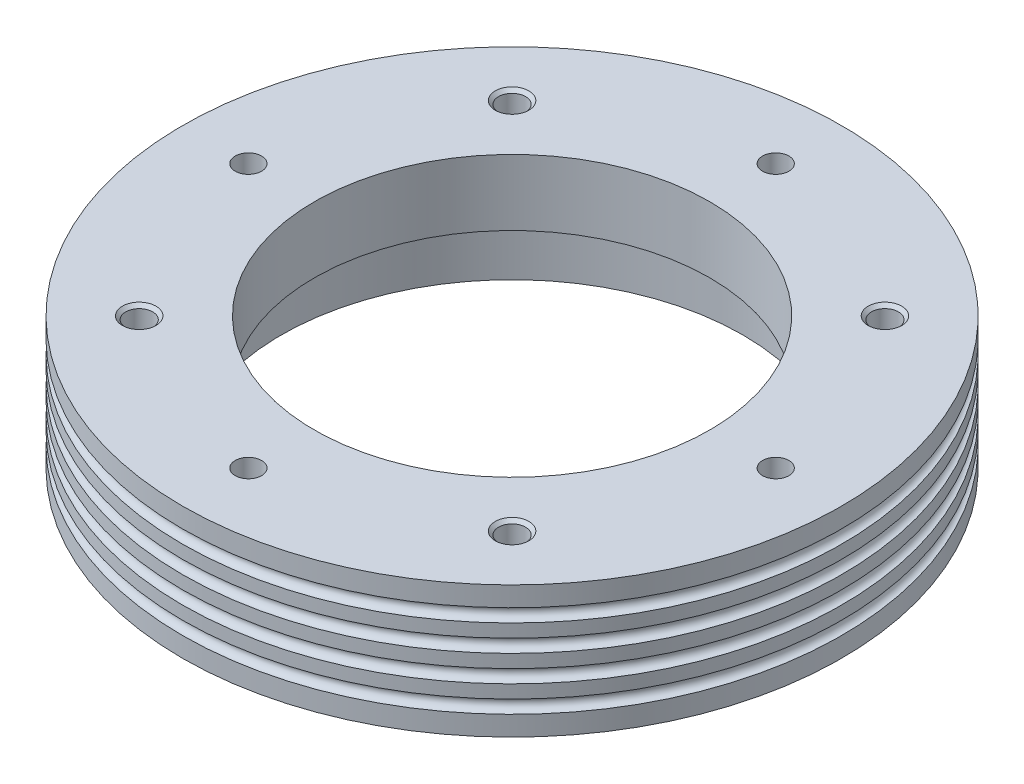
ISO-10303-21;
HEADER;
FILE_DESCRIPTION(('STEP AP214'),'2;1');
FILE_NAME('part.step','',(''),(''),'','','');
FILE_SCHEMA(('AUTOMOTIVE_DESIGN { 1 0 10303 214 1 1 1 1 }'));
ENDSEC;
DATA;
#1=APPLICATION_CONTEXT('core data for automotive mechanical design processes');
#2=APPLICATION_PROTOCOL_DEFINITION('international standard','automotive_design',2000,#1);
#3=PRODUCT_CONTEXT('',#1,'mechanical');
#4=PRODUCT('Part','Part','',(#3));
#5=PRODUCT_RELATED_PRODUCT_CATEGORY('part','',(#4));
#6=PRODUCT_DEFINITION_FORMATION('','',#4);
#7=PRODUCT_DEFINITION_CONTEXT('part definition',#1,'design');
#8=PRODUCT_DEFINITION('design','',#6,#7);
#9=PRODUCT_DEFINITION_SHAPE('','',#8);
#10=(LENGTH_UNIT() NAMED_UNIT(*) SI_UNIT(.MILLI.,.METRE.));
#11=(NAMED_UNIT(*) PLANE_ANGLE_UNIT() SI_UNIT($,.RADIAN.));
#12=(NAMED_UNIT(*) SI_UNIT($,.STERADIAN.) SOLID_ANGLE_UNIT());
#13=UNCERTAINTY_MEASURE_WITH_UNIT(LENGTH_MEASURE(1.E-05),#10,'distance_accuracy_value','');
#14=(GEOMETRIC_REPRESENTATION_CONTEXT(3) GLOBAL_UNCERTAINTY_ASSIGNED_CONTEXT((#13)) GLOBAL_UNIT_ASSIGNED_CONTEXT((#10,
#11,#12)) REPRESENTATION_CONTEXT('',''));
#15=CARTESIAN_POINT('',(0.,0.,0.));
#16=DIRECTION('',(0.,0.,1.));
#17=DIRECTION('',(1.,0.,0.));
#18=AXIS2_PLACEMENT_3D('',#15,#16,#17);
#19=CARTESIAN_POINT('',(0.,10.,0.));
#20=DIRECTION('',(0.,-1.,0.));
#21=DIRECTION('',(0.,0.,-1.));
#22=AXIS2_PLACEMENT_3D('',#19,#20,#21);
#23=CYLINDRICAL_SURFACE('',#22,25.);
#24=CARTESIAN_POINT('',(0.,8.5,0.));
#25=DIRECTION('',(0.,-1.,0.));
#26=DIRECTION('',(0.,0.,-1.));
#27=AXIS2_PLACEMENT_3D('',#24,#25,#26);
#28=CIRCLE('',#27,25.);
#29=CARTESIAN_POINT('',(0.,8.5,25.));
#30=VERTEX_POINT('',#29);
#31=EDGE_CURVE('E12',#30,#30,#28,.F.);
#32=ORIENTED_EDGE('',*,*,#31,.T.);
#33=EDGE_LOOP('',(#32));
#34=FACE_BOUND('',#33,.T.);
#35=CARTESIAN_POINT('',(0.,10.,0.));
#36=DIRECTION('',(0.,1.,0.));
#37=DIRECTION('',(0.,0.,1.));
#38=AXIS2_PLACEMENT_3D('',#35,#36,#37);
#39=CIRCLE('',#38,25.);
#40=CARTESIAN_POINT('',(0.,10.,25.));
#41=VERTEX_POINT('',#40);
#42=EDGE_CURVE('E215',#41,#41,#39,.T.);
#43=ORIENTED_EDGE('',*,*,#42,.F.);
#44=EDGE_LOOP('',(#43));
#45=FACE_BOUND('',#44,.T.);
#46=ADVANCED_FACE('F93',(#34,#45),#23,.T.);
#47=CARTESIAN_POINT('',(0.,7.5,0.));
#48=DIRECTION('',(0.,1.,0.));
#49=DIRECTION('',(0.,0.,1.));
#50=AXIS2_PLACEMENT_3D('',#47,#48,#49);
#51=CIRCLE('',#50,25.);
#52=CARTESIAN_POINT('',(0.,7.5,25.));
#53=VERTEX_POINT('',#52);
#54=EDGE_CURVE('E101',#53,#53,#51,.F.);
#55=ORIENTED_EDGE('',*,*,#54,.T.);
#56=EDGE_LOOP('',(#55));
#57=FACE_BOUND('',#56,.T.);
#58=CARTESIAN_POINT('',(0.,6.5,0.));
#59=DIRECTION('',(0.,-1.,0.));
#60=DIRECTION('',(0.,0.,-1.));
#61=AXIS2_PLACEMENT_3D('',#58,#59,#60);
#62=CIRCLE('',#61,25.);
#63=CARTESIAN_POINT('',(0.,6.5,25.));
#64=VERTEX_POINT('',#63);
#65=EDGE_CURVE('E231',#64,#64,#62,.F.);
#66=ORIENTED_EDGE('',*,*,#65,.T.);
#67=EDGE_LOOP('',(#66));
#68=FACE_BOUND('',#67,.T.);
#69=ADVANCED_FACE('F235',(#57,#68),#23,.T.);
#70=CARTESIAN_POINT('',(0.,5.5,0.));
#71=DIRECTION('',(0.,1.,0.));
#72=DIRECTION('',(0.,0.,1.));
#73=AXIS2_PLACEMENT_3D('',#70,#71,#72);
#74=CIRCLE('',#73,25.);
#75=CARTESIAN_POINT('',(0.,5.5,25.));
#76=VERTEX_POINT('',#75);
#77=EDGE_CURVE('E228',#76,#76,#74,.F.);
#78=ORIENTED_EDGE('',*,*,#77,.T.);
#79=EDGE_LOOP('',(#78));
#80=FACE_BOUND('',#79,.T.);
#81=CARTESIAN_POINT('',(0.,4.5,0.));
#82=DIRECTION('',(0.,-1.,0.));
#83=DIRECTION('',(0.,0.,-1.));
#84=AXIS2_PLACEMENT_3D('',#81,#82,#83);
#85=CIRCLE('',#84,25.);
#86=CARTESIAN_POINT('',(0.,4.5,25.));
#87=VERTEX_POINT('',#86);
#88=EDGE_CURVE('E225',#87,#87,#85,.F.);
#89=ORIENTED_EDGE('',*,*,#88,.T.);
#90=EDGE_LOOP('',(#89));
#91=FACE_BOUND('',#90,.T.);
#92=ADVANCED_FACE('F253',(#80,#91),#23,.T.);
#93=CARTESIAN_POINT('',(0.,3.5,0.));
#94=DIRECTION('',(0.,1.,0.));
#95=DIRECTION('',(0.,0.,1.));
#96=AXIS2_PLACEMENT_3D('',#93,#94,#95);
#97=CIRCLE('',#96,25.);
#98=CARTESIAN_POINT('',(0.,3.5,25.));
#99=VERTEX_POINT('',#98);
#100=EDGE_CURVE('E222',#99,#99,#97,.F.);
#101=ORIENTED_EDGE('',*,*,#100,.T.);
#102=EDGE_LOOP('',(#101));
#103=FACE_BOUND('',#102,.T.);
#104=CARTESIAN_POINT('',(0.,2.5,0.));
#105=DIRECTION('',(0.,-1.,0.));
#106=DIRECTION('',(0.,0.,-1.));
#107=AXIS2_PLACEMENT_3D('',#104,#105,#106);
#108=CIRCLE('',#107,25.);
#109=CARTESIAN_POINT('',(0.,2.5,25.));
#110=VERTEX_POINT('',#109);
#111=EDGE_CURVE('E135',#110,#110,#108,.F.);
#112=ORIENTED_EDGE('',*,*,#111,.T.);
#113=EDGE_LOOP('',(#112));
#114=FACE_BOUND('',#113,.T.);
#115=ADVANCED_FACE('F257',(#103,#114),#23,.T.);
#116=CARTESIAN_POINT('',(0.,1.5,0.));
#117=DIRECTION('',(0.,1.,0.));
#118=DIRECTION('',(0.,0.,1.));
#119=AXIS2_PLACEMENT_3D('',#116,#117,#118);
#120=CIRCLE('',#119,25.);
#121=CARTESIAN_POINT('',(0.,1.5,25.));
#122=VERTEX_POINT('',#121);
#123=EDGE_CURVE('E133',#122,#122,#120,.F.);
#124=ORIENTED_EDGE('',*,*,#123,.T.);
#125=EDGE_LOOP('',(#124));
#126=FACE_BOUND('',#125,.T.);
#127=CARTESIAN_POINT('',(0.,0.,0.));
#128=DIRECTION('',(0.,1.,0.));
#129=DIRECTION('',(0.,0.,1.));
#130=AXIS2_PLACEMENT_3D('',#127,#128,#129);
#131=CIRCLE('',#130,25.);
#132=CARTESIAN_POINT('',(0.,0.,25.));
#133=VERTEX_POINT('',#132);
#134=EDGE_CURVE('E214',#133,#133,#131,.T.);
#135=ORIENTED_EDGE('',*,*,#134,.T.);
#136=EDGE_LOOP('',(#135));
#137=FACE_BOUND('',#136,.T.);
#138=ADVANCED_FACE('F95',(#126,#137),#23,.T.);
#139=CARTESIAN_POINT('',(0.,10.,0.));
#140=DIRECTION('',(0.,1.,0.));
#141=DIRECTION('',(0.,0.,1.));
#142=AXIS2_PLACEMENT_3D('',#139,#140,#141);
#143=PLANE('',#142);
#144=CARTESIAN_POINT('',(14.1421356237309,10.,-14.142135623731));
#145=DIRECTION('',(0.,1.,0.));
#146=DIRECTION('',(0.,0.,1.));
#147=AXIS2_PLACEMENT_3D('',#144,#145,#146);
#148=CIRCLE('',#147,1.275);
#149=CARTESIAN_POINT('',(14.1421356237309,10.,-12.867135623731));
#150=VERTEX_POINT('',#149);
#151=EDGE_CURVE('E136',#150,#150,#148,.T.);
#152=ORIENTED_EDGE('',*,*,#151,.F.);
#153=EDGE_LOOP('',(#152));
#154=FACE_BOUND('',#153,.T.);
#155=CARTESIAN_POINT('',(14.142135623731,10.,14.1421356237309));
#156=DIRECTION('',(0.,1.,0.));
#157=DIRECTION('',(0.,0.,1.));
#158=AXIS2_PLACEMENT_3D('',#155,#156,#157);
#159=CIRCLE('',#158,1.275);
#160=CARTESIAN_POINT('',(14.142135623731,10.,15.4171356237309));
#161=VERTEX_POINT('',#160);
#162=EDGE_CURVE('E151',#161,#161,#159,.T.);
#163=ORIENTED_EDGE('',*,*,#162,.F.);
#164=EDGE_LOOP('',(#163));
#165=FACE_BOUND('',#164,.T.);
#166=CARTESIAN_POINT('',(-14.142135623731,10.,14.1421356237309));
#167=DIRECTION('',(0.,1.,0.));
#168=DIRECTION('',(0.,0.,1.));
#169=AXIS2_PLACEMENT_3D('',#166,#167,#168);
#170=CIRCLE('',#169,1.275);
#171=CARTESIAN_POINT('',(-14.142135623731,10.,15.4171356237309));
#172=VERTEX_POINT('',#171);
#173=EDGE_CURVE('E160',#172,#172,#170,.T.);
#174=ORIENTED_EDGE('',*,*,#173,.F.);
#175=EDGE_LOOP('',(#174));
#176=FACE_BOUND('',#175,.T.);
#177=CARTESIAN_POINT('',(-14.1421356237308,10.,-14.1421356237311));
#178=DIRECTION('',(0.,1.,0.));
#179=DIRECTION('',(0.,0.,1.));
#180=AXIS2_PLACEMENT_3D('',#177,#178,#179);
#181=CIRCLE('',#180,1.275);
#182=CARTESIAN_POINT('',(-14.1421356237308,10.,-12.8671356237311));
#183=VERTEX_POINT('',#182);
#184=EDGE_CURVE('E169',#183,#183,#181,.T.);
#185=ORIENTED_EDGE('',*,*,#184,.F.);
#186=EDGE_LOOP('',(#185));
#187=FACE_BOUND('',#186,.T.);
#188=CARTESIAN_POINT('',(0.,10.,0.));
#189=DIRECTION('',(0.,-1.,0.));
#190=DIRECTION('',(0.,0.,-1.));
#191=AXIS2_PLACEMENT_3D('',#188,#189,#190);
#192=CIRCLE('',#191,15.);
#193=CARTESIAN_POINT('',(0.,10.,-15.));
#194=VERTEX_POINT('',#193);
#195=EDGE_CURVE('E179',#194,#194,#192,.T.);
#196=ORIENTED_EDGE('',*,*,#195,.T.);
#197=EDGE_LOOP('',(#196));
#198=FACE_BOUND('',#197,.T.);
#199=CARTESIAN_POINT('',(20.,10.,0.));
#200=DIRECTION('',(0.,1.,0.));
#201=DIRECTION('',(0.,0.,1.));
#202=AXIS2_PLACEMENT_3D('',#199,#200,#201);
#203=CIRCLE('',#202,1.00000000000001);
#204=CARTESIAN_POINT('',(20.,10.,1.00000000000001));
#205=VERTEX_POINT('',#204);
#206=EDGE_CURVE('E188',#205,#205,#203,.T.);
#207=ORIENTED_EDGE('',*,*,#206,.F.);
#208=EDGE_LOOP('',(#207));
#209=FACE_BOUND('',#208,.T.);
#210=CARTESIAN_POINT('',(0.,10.,-20.));
#211=DIRECTION('',(0.,1.,0.));
#212=DIRECTION('',(0.,0.,1.));
#213=AXIS2_PLACEMENT_3D('',#210,#211,#212);
#214=CIRCLE('',#213,1.00000000000001);
#215=CARTESIAN_POINT('',(0.,10.,-19.));
#216=VERTEX_POINT('',#215);
#217=EDGE_CURVE('E196',#216,#216,#214,.T.);
#218=ORIENTED_EDGE('',*,*,#217,.F.);
#219=EDGE_LOOP('',(#218));
#220=FACE_BOUND('',#219,.T.);
#221=CARTESIAN_POINT('',(-20.,10.,0.));
#222=DIRECTION('',(0.,1.,0.));
#223=DIRECTION('',(0.,0.,1.));
#224=AXIS2_PLACEMENT_3D('',#221,#222,#223);
#225=CIRCLE('',#224,1.00000000000001);
#226=CARTESIAN_POINT('',(-20.,10.,1.00000000000001));
#227=VERTEX_POINT('',#226);
#228=EDGE_CURVE('E202',#227,#227,#225,.T.);
#229=ORIENTED_EDGE('',*,*,#228,.F.);
#230=EDGE_LOOP('',(#229));
#231=FACE_BOUND('',#230,.T.);
#232=CARTESIAN_POINT('',(0.,10.,20.));
#233=DIRECTION('',(0.,1.,0.));
#234=DIRECTION('',(0.,0.,1.));
#235=AXIS2_PLACEMENT_3D('',#232,#233,#234);
#236=CIRCLE('',#235,1.00000000000001);
#237=CARTESIAN_POINT('',(0.,10.,21.));
#238=VERTEX_POINT('',#237);
#239=EDGE_CURVE('E208',#238,#238,#236,.T.);
#240=ORIENTED_EDGE('',*,*,#239,.F.);
#241=EDGE_LOOP('',(#240));
#242=FACE_BOUND('',#241,.T.);
#243=ORIENTED_EDGE('',*,*,#42,.T.);
#244=EDGE_LOOP('',(#243));
#245=FACE_BOUND('',#244,.T.);
#246=ADVANCED_FACE('F256',(#154,#165,#176,#187,#198,#209,#220,#231,#242,#245),#143,.T.);
#247=CARTESIAN_POINT('',(0.,0.,0.));
#248=DIRECTION('',(0.,1.,0.));
#249=DIRECTION('',(0.,0.,1.));
#250=AXIS2_PLACEMENT_3D('',#247,#248,#249);
#251=PLANE('',#250);
#252=CARTESIAN_POINT('',(14.1421356237309,0.,-14.142135623731));
#253=DIRECTION('',(0.,1.,0.));
#254=DIRECTION('',(0.,0.,1.));
#255=AXIS2_PLACEMENT_3D('',#252,#253,#254);
#256=CIRCLE('',#255,1.025);
#257=CARTESIAN_POINT('',(14.1421356237309,0.,-13.117135623731));
#258=VERTEX_POINT('',#257);
#259=EDGE_CURVE('E148',#258,#258,#256,.T.);
#260=ORIENTED_EDGE('',*,*,#259,.T.);
#261=EDGE_LOOP('',(#260));
#262=FACE_BOUND('',#261,.T.);
#263=CARTESIAN_POINT('',(14.142135623731,0.,14.1421356237309));
#264=DIRECTION('',(0.,1.,0.));
#265=DIRECTION('',(0.,0.,1.));
#266=AXIS2_PLACEMENT_3D('',#263,#264,#265);
#267=CIRCLE('',#266,1.025);
#268=CARTESIAN_POINT('',(14.142135623731,0.,15.1671356237309));
#269=VERTEX_POINT('',#268);
#270=EDGE_CURVE('E157',#269,#269,#267,.T.);
#271=ORIENTED_EDGE('',*,*,#270,.T.);
#272=EDGE_LOOP('',(#271));
#273=FACE_BOUND('',#272,.T.);
#274=CARTESIAN_POINT('',(-14.142135623731,0.,14.1421356237309));
#275=DIRECTION('',(0.,1.,0.));
#276=DIRECTION('',(0.,0.,1.));
#277=AXIS2_PLACEMENT_3D('',#274,#275,#276);
#278=CIRCLE('',#277,1.025);
#279=CARTESIAN_POINT('',(-14.142135623731,0.,15.1671356237309));
#280=VERTEX_POINT('',#279);
#281=EDGE_CURVE('E166',#280,#280,#278,.T.);
#282=ORIENTED_EDGE('',*,*,#281,.T.);
#283=EDGE_LOOP('',(#282));
#284=FACE_BOUND('',#283,.T.);
#285=CARTESIAN_POINT('',(-14.1421356237308,0.,-14.1421356237311));
#286=DIRECTION('',(0.,1.,0.));
#287=DIRECTION('',(0.,0.,1.));
#288=AXIS2_PLACEMENT_3D('',#285,#286,#287);
#289=CIRCLE('',#288,1.025);
#290=CARTESIAN_POINT('',(-14.1421356237308,0.,-13.1171356237311));
#291=VERTEX_POINT('',#290);
#292=EDGE_CURVE('E175',#291,#291,#289,.T.);
#293=ORIENTED_EDGE('',*,*,#292,.T.);
#294=EDGE_LOOP('',(#293));
#295=FACE_BOUND('',#294,.T.);
#296=CARTESIAN_POINT('',(0.,0.,0.));
#297=DIRECTION('',(0.,-1.,0.));
#298=DIRECTION('',(0.,0.,-1.));
#299=AXIS2_PLACEMENT_3D('',#296,#297,#298);
#300=CIRCLE('',#299,17.5);
#301=CARTESIAN_POINT('',(0.,0.,-17.5));
#302=VERTEX_POINT('',#301);
#303=EDGE_CURVE('E182',#302,#302,#300,.T.);
#304=ORIENTED_EDGE('',*,*,#303,.F.);
#305=EDGE_LOOP('',(#304));
#306=FACE_BOUND('',#305,.T.);
#307=CARTESIAN_POINT('',(20.,0.,0.));
#308=DIRECTION('',(0.,1.,0.));
#309=DIRECTION('',(0.,0.,1.));
#310=AXIS2_PLACEMENT_3D('',#307,#308,#309);
#311=CIRCLE('',#310,1.00000000000001);
#312=CARTESIAN_POINT('',(20.,0.,1.00000000000001));
#313=VERTEX_POINT('',#312);
#314=EDGE_CURVE('E193',#313,#313,#311,.T.);
#315=ORIENTED_EDGE('',*,*,#314,.T.);
#316=EDGE_LOOP('',(#315));
#317=FACE_BOUND('',#316,.T.);
#318=CARTESIAN_POINT('',(0.,0.,-20.));
#319=DIRECTION('',(0.,1.,0.));
#320=DIRECTION('',(0.,0.,1.));
#321=AXIS2_PLACEMENT_3D('',#318,#319,#320);
#322=CIRCLE('',#321,1.00000000000001);
#323=CARTESIAN_POINT('',(0.,0.,-19.));
#324=VERTEX_POINT('',#323);
#325=EDGE_CURVE('E199',#324,#324,#322,.T.);
#326=ORIENTED_EDGE('',*,*,#325,.T.);
#327=EDGE_LOOP('',(#326));
#328=FACE_BOUND('',#327,.T.);
#329=CARTESIAN_POINT('',(-20.,0.,0.));
#330=DIRECTION('',(0.,1.,0.));
#331=DIRECTION('',(0.,0.,1.));
#332=AXIS2_PLACEMENT_3D('',#329,#330,#331);
#333=CIRCLE('',#332,1.00000000000001);
#334=CARTESIAN_POINT('',(-20.,0.,1.00000000000001));
#335=VERTEX_POINT('',#334);
#336=EDGE_CURVE('E205',#335,#335,#333,.T.);
#337=ORIENTED_EDGE('',*,*,#336,.T.);
#338=EDGE_LOOP('',(#337));
#339=FACE_BOUND('',#338,.T.);
#340=CARTESIAN_POINT('',(0.,0.,20.));
#341=DIRECTION('',(0.,1.,0.));
#342=DIRECTION('',(0.,0.,1.));
#343=AXIS2_PLACEMENT_3D('',#340,#341,#342);
#344=CIRCLE('',#343,1.00000000000001);
#345=CARTESIAN_POINT('',(0.,0.,21.));
#346=VERTEX_POINT('',#345);
#347=EDGE_CURVE('E211',#346,#346,#344,.T.);
#348=ORIENTED_EDGE('',*,*,#347,.T.);
#349=EDGE_LOOP('',(#348));
#350=FACE_BOUND('',#349,.T.);
#351=ORIENTED_EDGE('',*,*,#134,.F.);
#352=EDGE_LOOP('',(#351));
#353=FACE_BOUND('',#352,.T.);
#354=ADVANCED_FACE('F263',(#262,#273,#284,#295,#306,#317,#328,#339,#350,#353),#251,.F.);
#355=CARTESIAN_POINT('',(0.,10.,20.));
#356=DIRECTION('',(0.,1.,0.));
#357=DIRECTION('',(0.,0.,1.));
#358=AXIS2_PLACEMENT_3D('',#355,#356,#357);
#359=CYLINDRICAL_SURFACE('',#358,1.00000000000001);
#360=ORIENTED_EDGE('',*,*,#347,.F.);
#361=EDGE_LOOP('',(#360));
#362=FACE_BOUND('',#361,.T.);
#363=ORIENTED_EDGE('',*,*,#239,.T.);
#364=EDGE_LOOP('',(#363));
#365=FACE_BOUND('',#364,.T.);
#366=ADVANCED_FACE('F272',(#362,#365),#359,.F.);
#367=CARTESIAN_POINT('',(-20.,10.,0.));
#368=DIRECTION('',(0.,1.,0.));
#369=DIRECTION('',(0.,0.,1.));
#370=AXIS2_PLACEMENT_3D('',#367,#368,#369);
#371=CYLINDRICAL_SURFACE('',#370,1.00000000000001);
#372=ORIENTED_EDGE('',*,*,#336,.F.);
#373=EDGE_LOOP('',(#372));
#374=FACE_BOUND('',#373,.T.);
#375=ORIENTED_EDGE('',*,*,#228,.T.);
#376=EDGE_LOOP('',(#375));
#377=FACE_BOUND('',#376,.T.);
#378=ADVANCED_FACE('F278',(#374,#377),#371,.F.);
#379=CARTESIAN_POINT('',(0.,10.,-20.));
#380=DIRECTION('',(0.,1.,0.));
#381=DIRECTION('',(0.,0.,1.));
#382=AXIS2_PLACEMENT_3D('',#379,#380,#381);
#383=CYLINDRICAL_SURFACE('',#382,1.00000000000001);
#384=ORIENTED_EDGE('',*,*,#325,.F.);
#385=EDGE_LOOP('',(#384));
#386=FACE_BOUND('',#385,.T.);
#387=ORIENTED_EDGE('',*,*,#217,.T.);
#388=EDGE_LOOP('',(#387));
#389=FACE_BOUND('',#388,.T.);
#390=ADVANCED_FACE('F285',(#386,#389),#383,.F.);
#391=CARTESIAN_POINT('',(20.,10.,0.));
#392=DIRECTION('',(0.,1.,0.));
#393=DIRECTION('',(0.,0.,1.));
#394=AXIS2_PLACEMENT_3D('',#391,#392,#393);
#395=CYLINDRICAL_SURFACE('',#394,1.00000000000001);
#396=ORIENTED_EDGE('',*,*,#314,.F.);
#397=EDGE_LOOP('',(#396));
#398=FACE_BOUND('',#397,.T.);
#399=ORIENTED_EDGE('',*,*,#206,.T.);
#400=EDGE_LOOP('',(#399));
#401=FACE_BOUND('',#400,.T.);
#402=ADVANCED_FACE('F289',(#398,#401),#395,.F.);
#403=CARTESIAN_POINT('',(0.,5.,0.));
#404=DIRECTION('',(0.,-1.,0.));
#405=DIRECTION('',(0.,0.,-1.));
#406=AXIS2_PLACEMENT_3D('',#403,#404,#405);
#407=CYLINDRICAL_SURFACE('',#406,17.5);
#408=CARTESIAN_POINT('',(0.,5.,0.));
#409=DIRECTION('',(0.,-1.,0.));
#410=DIRECTION('',(0.,0.,-1.));
#411=AXIS2_PLACEMENT_3D('',#408,#409,#410);
#412=CIRCLE('',#411,17.5);
#413=CARTESIAN_POINT('',(0.,5.,-17.5));
#414=VERTEX_POINT('',#413);
#415=EDGE_CURVE('E185',#414,#414,#412,.T.);
#416=ORIENTED_EDGE('',*,*,#415,.F.);
#417=EDGE_LOOP('',(#416));
#418=FACE_BOUND('',#417,.T.);
#419=ORIENTED_EDGE('',*,*,#303,.T.);
#420=EDGE_LOOP('',(#419));
#421=FACE_BOUND('',#420,.T.);
#422=ADVANCED_FACE('F293',(#418,#421),#407,.F.);
#423=CARTESIAN_POINT('',(0.,5.,0.));
#424=DIRECTION('',(0.,-1.,0.));
#425=DIRECTION('',(0.,0.,-1.));
#426=AXIS2_PLACEMENT_3D('',#423,#424,#425);
#427=PLANE('',#426);
#428=CARTESIAN_POINT('',(0.,5.,0.));
#429=DIRECTION('',(0.,-1.,0.));
#430=DIRECTION('',(0.,0.,-1.));
#431=AXIS2_PLACEMENT_3D('',#428,#429,#430);
#432=CIRCLE('',#431,15.);
#433=CARTESIAN_POINT('',(0.,5.,-15.));
#434=VERTEX_POINT('',#433);
#435=EDGE_CURVE('E178',#434,#434,#432,.T.);
#436=ORIENTED_EDGE('',*,*,#435,.F.);
#437=EDGE_LOOP('',(#436));
#438=FACE_BOUND('',#437,.T.);
#439=ORIENTED_EDGE('',*,*,#415,.T.);
#440=EDGE_LOOP('',(#439));
#441=FACE_BOUND('',#440,.T.);
#442=ADVANCED_FACE('F297',(#438,#441),#427,.T.);
#443=CARTESIAN_POINT('',(0.,10.,0.));
#444=DIRECTION('',(0.,-1.,0.));
#445=DIRECTION('',(0.,0.,-1.));
#446=AXIS2_PLACEMENT_3D('',#443,#444,#445);
#447=CYLINDRICAL_SURFACE('',#446,15.);
#448=ORIENTED_EDGE('',*,*,#195,.F.);
#449=EDGE_LOOP('',(#448));
#450=FACE_BOUND('',#449,.T.);
#451=ORIENTED_EDGE('',*,*,#435,.T.);
#452=EDGE_LOOP('',(#451));
#453=FACE_BOUND('',#452,.T.);
#454=ADVANCED_FACE('F301',(#450,#453),#447,.F.);
#455=CARTESIAN_POINT('',(-14.1421356237308,10.,-14.1421356237311));
#456=DIRECTION('',(0.,1.,0.));
#457=DIRECTION('',(0.,0.,1.));
#458=AXIS2_PLACEMENT_3D('',#455,#456,#457);
#459=CYLINDRICAL_SURFACE('',#458,1.025);
#460=ORIENTED_EDGE('',*,*,#292,.F.);
#461=EDGE_LOOP('',(#460));
#462=FACE_BOUND('',#461,.T.);
#463=CARTESIAN_POINT('',(-14.1421356237308,9.75,-14.1421356237311));
#464=DIRECTION('',(0.,1.,0.));
#465=DIRECTION('',(0.,0.,1.));
#466=AXIS2_PLACEMENT_3D('',#463,#464,#465);
#467=CIRCLE('',#466,1.025);
#468=CARTESIAN_POINT('',(-14.1421356237308,9.75,-13.1171356237311));
#469=VERTEX_POINT('',#468);
#470=EDGE_CURVE('E172',#469,#469,#467,.T.);
#471=ORIENTED_EDGE('',*,*,#470,.T.);
#472=EDGE_LOOP('',(#471));
#473=FACE_BOUND('',#472,.T.);
#474=ADVANCED_FACE('F305',(#462,#473),#459,.F.);
#475=CARTESIAN_POINT('',(-14.1421356237308,10.,-14.1421356237311));
#476=DIRECTION('',(0.,1.,0.));
#477=DIRECTION('',(0.,0.,1.));
#478=AXIS2_PLACEMENT_3D('',#475,#476,#477);
#479=CONICAL_SURFACE('',#478,1.275,0.785398163397448);
#480=ORIENTED_EDGE('',*,*,#470,.F.);
#481=EDGE_LOOP('',(#480));
#482=FACE_BOUND('',#481,.T.);
#483=ORIENTED_EDGE('',*,*,#184,.T.);
#484=EDGE_LOOP('',(#483));
#485=FACE_BOUND('',#484,.T.);
#486=ADVANCED_FACE('F309',(#482,#485),#479,.F.);
#487=CARTESIAN_POINT('',(-14.142135623731,10.,14.1421356237309));
#488=DIRECTION('',(0.,1.,0.));
#489=DIRECTION('',(0.,0.,1.));
#490=AXIS2_PLACEMENT_3D('',#487,#488,#489);
#491=CYLINDRICAL_SURFACE('',#490,1.025);
#492=ORIENTED_EDGE('',*,*,#281,.F.);
#493=EDGE_LOOP('',(#492));
#494=FACE_BOUND('',#493,.T.);
#495=CARTESIAN_POINT('',(-14.142135623731,9.75,14.1421356237309));
#496=DIRECTION('',(0.,1.,0.));
#497=DIRECTION('',(0.,0.,1.));
#498=AXIS2_PLACEMENT_3D('',#495,#496,#497);
#499=CIRCLE('',#498,1.025);
#500=CARTESIAN_POINT('',(-14.142135623731,9.75,15.1671356237309));
#501=VERTEX_POINT('',#500);
#502=EDGE_CURVE('E163',#501,#501,#499,.T.);
#503=ORIENTED_EDGE('',*,*,#502,.T.);
#504=EDGE_LOOP('',(#503));
#505=FACE_BOUND('',#504,.T.);
#506=ADVANCED_FACE('F313',(#494,#505),#491,.F.);
#507=CARTESIAN_POINT('',(-14.142135623731,10.,14.1421356237309));
#508=DIRECTION('',(0.,1.,0.));
#509=DIRECTION('',(0.,0.,1.));
#510=AXIS2_PLACEMENT_3D('',#507,#508,#509);
#511=CONICAL_SURFACE('',#510,1.275,0.785398163397448);
#512=ORIENTED_EDGE('',*,*,#502,.F.);
#513=EDGE_LOOP('',(#512));
#514=FACE_BOUND('',#513,.T.);
#515=ORIENTED_EDGE('',*,*,#173,.T.);
#516=EDGE_LOOP('',(#515));
#517=FACE_BOUND('',#516,.T.);
#518=ADVANCED_FACE('F317',(#514,#517),#511,.F.);
#519=CARTESIAN_POINT('',(14.142135623731,10.,14.1421356237309));
#520=DIRECTION('',(0.,1.,0.));
#521=DIRECTION('',(0.,0.,1.));
#522=AXIS2_PLACEMENT_3D('',#519,#520,#521);
#523=CYLINDRICAL_SURFACE('',#522,1.025);
#524=ORIENTED_EDGE('',*,*,#270,.F.);
#525=EDGE_LOOP('',(#524));
#526=FACE_BOUND('',#525,.T.);
#527=CARTESIAN_POINT('',(14.142135623731,9.75,14.1421356237309));
#528=DIRECTION('',(0.,1.,0.));
#529=DIRECTION('',(0.,0.,1.));
#530=AXIS2_PLACEMENT_3D('',#527,#528,#529);
#531=CIRCLE('',#530,1.025);
#532=CARTESIAN_POINT('',(14.142135623731,9.75,15.1671356237309));
#533=VERTEX_POINT('',#532);
#534=EDGE_CURVE('E154',#533,#533,#531,.T.);
#535=ORIENTED_EDGE('',*,*,#534,.T.);
#536=EDGE_LOOP('',(#535));
#537=FACE_BOUND('',#536,.T.);
#538=ADVANCED_FACE('F321',(#526,#537),#523,.F.);
#539=CARTESIAN_POINT('',(14.142135623731,10.,14.1421356237309));
#540=DIRECTION('',(0.,1.,0.));
#541=DIRECTION('',(0.,0.,1.));
#542=AXIS2_PLACEMENT_3D('',#539,#540,#541);
#543=CONICAL_SURFACE('',#542,1.275,0.785398163397448);
#544=ORIENTED_EDGE('',*,*,#534,.F.);
#545=EDGE_LOOP('',(#544));
#546=FACE_BOUND('',#545,.T.);
#547=ORIENTED_EDGE('',*,*,#162,.T.);
#548=EDGE_LOOP('',(#547));
#549=FACE_BOUND('',#548,.T.);
#550=ADVANCED_FACE('F325',(#546,#549),#543,.F.);
#551=CARTESIAN_POINT('',(14.1421356237309,10.,-14.142135623731));
#552=DIRECTION('',(0.,1.,0.));
#553=DIRECTION('',(0.,0.,1.));
#554=AXIS2_PLACEMENT_3D('',#551,#552,#553);
#555=CYLINDRICAL_SURFACE('',#554,1.025);
#556=ORIENTED_EDGE('',*,*,#259,.F.);
#557=EDGE_LOOP('',(#556));
#558=FACE_BOUND('',#557,.T.);
#559=CARTESIAN_POINT('',(14.1421356237309,9.75,-14.142135623731));
#560=DIRECTION('',(0.,1.,0.));
#561=DIRECTION('',(0.,0.,1.));
#562=AXIS2_PLACEMENT_3D('',#559,#560,#561);
#563=CIRCLE('',#562,1.025);
#564=CARTESIAN_POINT('',(14.1421356237309,9.75,-13.117135623731));
#565=VERTEX_POINT('',#564);
#566=EDGE_CURVE('E140',#565,#565,#563,.T.);
#567=ORIENTED_EDGE('',*,*,#566,.T.);
#568=EDGE_LOOP('',(#567));
#569=FACE_BOUND('',#568,.T.);
#570=ADVANCED_FACE('F329',(#558,#569),#555,.F.);
#571=CARTESIAN_POINT('',(14.1421356237309,10.,-14.142135623731));
#572=DIRECTION('',(0.,1.,0.));
#573=DIRECTION('',(0.,0.,1.));
#574=AXIS2_PLACEMENT_3D('',#571,#572,#573);
#575=CONICAL_SURFACE('',#574,1.275,0.785398163397448);
#576=ORIENTED_EDGE('',*,*,#566,.F.);
#577=EDGE_LOOP('',(#576));
#578=FACE_BOUND('',#577,.T.);
#579=ORIENTED_EDGE('',*,*,#151,.T.);
#580=EDGE_LOOP('',(#579));
#581=FACE_BOUND('',#580,.T.);
#582=ADVANCED_FACE('F333',(#578,#581),#575,.F.);
#583=CARTESIAN_POINT('',(0.,2.,0.));
#584=DIRECTION('',(0.,1.,0.));
#585=DIRECTION('',(0.,0.,1.));
#586=AXIS2_PLACEMENT_3D('',#583,#584,#585);
#587=TOROIDAL_SURFACE('',#586,25.,0.5);
#588=CARTESIAN_POINT('',(0.,2.,25.));
#589=DIRECTION('',(1.,0.,0.));
#590=DIRECTION('',(0.,0.,-1.));
#591=AXIS2_PLACEMENT_3D('',#588,#589,#590);
#592=CIRCLE('',#591,0.5);
#593=EDGE_CURVE('E130',#122,#110,#592,.T.);
#594=ORIENTED_EDGE('',*,*,#593,.F.);
#595=ORIENTED_EDGE('',*,*,#123,.F.);
#596=ORIENTED_EDGE('',*,*,#593,.T.);
#597=ORIENTED_EDGE('',*,*,#111,.F.);
#598=EDGE_LOOP('',(#594,#595,#596,#597));
#599=FACE_BOUND('',#598,.T.);
#600=ADVANCED_FACE('F131',(#599),#587,.F.);
#601=CARTESIAN_POINT('',(0.,4.,0.));
#602=DIRECTION('',(0.,1.,0.));
#603=DIRECTION('',(0.,0.,1.));
#604=AXIS2_PLACEMENT_3D('',#601,#602,#603);
#605=TOROIDAL_SURFACE('',#604,25.,0.5);
#606=CARTESIAN_POINT('',(0.,4.,25.));
#607=DIRECTION('',(1.,0.,0.));
#608=DIRECTION('',(0.,0.,-1.));
#609=AXIS2_PLACEMENT_3D('',#606,#607,#608);
#610=CIRCLE('',#609,0.5);
#611=EDGE_CURVE('E137',#99,#87,#610,.T.);
#612=ORIENTED_EDGE('',*,*,#611,.F.);
#613=ORIENTED_EDGE('',*,*,#100,.F.);
#614=ORIENTED_EDGE('',*,*,#611,.T.);
#615=ORIENTED_EDGE('',*,*,#88,.F.);
#616=EDGE_LOOP('',(#612,#613,#614,#615));
#617=FACE_BOUND('',#616,.T.);
#618=ADVANCED_FACE('F244',(#617),#605,.F.);
#619=CARTESIAN_POINT('',(0.,6.,0.));
#620=DIRECTION('',(0.,1.,0.));
#621=DIRECTION('',(0.,0.,1.));
#622=AXIS2_PLACEMENT_3D('',#619,#620,#621);
#623=TOROIDAL_SURFACE('',#622,25.,0.5);
#624=CARTESIAN_POINT('',(0.,6.,25.));
#625=DIRECTION('',(1.,0.,0.));
#626=DIRECTION('',(0.,0.,-1.));
#627=AXIS2_PLACEMENT_3D('',#624,#625,#626);
#628=CIRCLE('',#627,0.5);
#629=EDGE_CURVE('E142',#76,#64,#628,.T.);
#630=ORIENTED_EDGE('',*,*,#629,.F.);
#631=ORIENTED_EDGE('',*,*,#77,.F.);
#632=ORIENTED_EDGE('',*,*,#629,.T.);
#633=ORIENTED_EDGE('',*,*,#65,.F.);
#634=EDGE_LOOP('',(#630,#631,#632,#633));
#635=FACE_BOUND('',#634,.T.);
#636=ADVANCED_FACE('F239',(#635),#623,.F.);
#637=CARTESIAN_POINT('',(0.,8.,0.));
#638=DIRECTION('',(0.,1.,0.));
#639=DIRECTION('',(0.,0.,1.));
#640=AXIS2_PLACEMENT_3D('',#637,#638,#639);
#641=TOROIDAL_SURFACE('',#640,25.,0.5);
#642=CARTESIAN_POINT('',(0.,8.,25.));
#643=DIRECTION('',(1.,0.,0.));
#644=DIRECTION('',(0.,0.,-1.));
#645=AXIS2_PLACEMENT_3D('',#642,#643,#644);
#646=CIRCLE('',#645,0.5);
#647=EDGE_CURVE('E108',#53,#30,#646,.T.);
#648=ORIENTED_EDGE('',*,*,#647,.F.);
#649=ORIENTED_EDGE('',*,*,#54,.F.);
#650=ORIENTED_EDGE('',*,*,#647,.T.);
#651=ORIENTED_EDGE('',*,*,#31,.F.);
#652=EDGE_LOOP('',(#648,#649,#650,#651));
#653=FACE_BOUND('',#652,.T.);
#654=ADVANCED_FACE('F237',(#653),#641,.F.);
#655=CLOSED_SHELL('',(#46,#69,#92,#115,#138,#246,#354,#366,#378,#390,#402,#422,#442,#454,#474,
#486,#506,#518,#538,#550,#570,#582,#600,#618,#636,#654));
#656=MANIFOLD_SOLID_BREP('B2',#655);
#657=ADVANCED_BREP_SHAPE_REPRESENTATION('',(#18,#656),#14);
#658=SHAPE_DEFINITION_REPRESENTATION(#9,#657);
ENDSEC;
END-ISO-10303-21;
